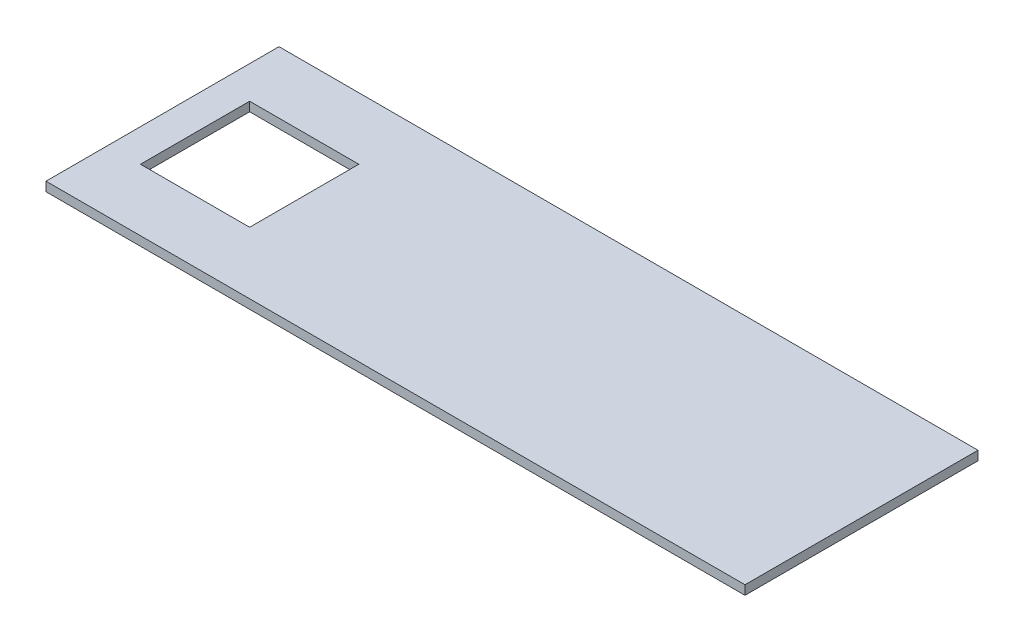
ISO-10303-21;
HEADER;
FILE_DESCRIPTION(('STEP AP214'),'2;1');
FILE_NAME('part.step','',(''),(''),'','','');
FILE_SCHEMA(('AUTOMOTIVE_DESIGN { 1 0 10303 214 1 1 1 1 }'));
ENDSEC;
DATA;
#1=APPLICATION_CONTEXT('core data for automotive mechanical design processes');
#2=APPLICATION_PROTOCOL_DEFINITION('international standard','automotive_design',2000,#1);
#3=PRODUCT_CONTEXT('',#1,'mechanical');
#4=PRODUCT('Part','Part','',(#3));
#5=PRODUCT_RELATED_PRODUCT_CATEGORY('part','',(#4));
#6=PRODUCT_DEFINITION_FORMATION('','',#4);
#7=PRODUCT_DEFINITION_CONTEXT('part definition',#1,'design');
#8=PRODUCT_DEFINITION('design','',#6,#7);
#9=PRODUCT_DEFINITION_SHAPE('','',#8);
#10=(LENGTH_UNIT() NAMED_UNIT(*) SI_UNIT(.MILLI.,.METRE.));
#11=(NAMED_UNIT(*) PLANE_ANGLE_UNIT() SI_UNIT($,.RADIAN.));
#12=(NAMED_UNIT(*) SI_UNIT($,.STERADIAN.) SOLID_ANGLE_UNIT());
#13=UNCERTAINTY_MEASURE_WITH_UNIT(LENGTH_MEASURE(1.E-05),#10,'distance_accuracy_value','');
#14=(GEOMETRIC_REPRESENTATION_CONTEXT(3) GLOBAL_UNCERTAINTY_ASSIGNED_CONTEXT((#13)) GLOBAL_UNIT_ASSIGNED_CONTEXT((#10,
#11,#12)) REPRESENTATION_CONTEXT('',''));
#15=CARTESIAN_POINT('',(0.,0.,0.));
#16=DIRECTION('',(0.,0.,1.));
#17=DIRECTION('',(1.,0.,0.));
#18=AXIS2_PLACEMENT_3D('',#15,#16,#17);
#19=CARTESIAN_POINT('',(0.,1.,0.));
#20=DIRECTION('',(1.,0.,0.));
#21=DIRECTION('',(0.,0.,-1.));
#22=AXIS2_PLACEMENT_3D('',#19,#20,#21);
#23=PLANE('',#22);
#24=DIRECTION('',(0.,0.,1.));
#25=VECTOR('',#24,1.);
#26=CARTESIAN_POINT('',(0.,0.,0.));
#27=LINE('',#26,#25);
#28=CARTESIAN_POINT('',(0.,0.,0.));
#29=VERTEX_POINT('',#28);
#30=CARTESIAN_POINT('',(0.,0.,25.4));
#31=VERTEX_POINT('',#30);
#32=EDGE_CURVE('E147',#29,#31,#27,.T.);
#33=ORIENTED_EDGE('',*,*,#32,.T.);
#34=DIRECTION('',(0.,-1.,0.));
#35=VECTOR('',#34,1.);
#36=CARTESIAN_POINT('',(0.,1.,25.4));
#37=LINE('',#36,#35);
#38=CARTESIAN_POINT('',(0.,1.,25.4));
#39=VERTEX_POINT('',#38);
#40=EDGE_CURVE('E11',#39,#31,#37,.T.);
#41=ORIENTED_EDGE('',*,*,#40,.F.);
#42=DIRECTION('',(0.,0.,1.));
#43=VECTOR('',#42,1.);
#44=CARTESIAN_POINT('',(0.,1.,0.));
#45=LINE('',#44,#43);
#46=CARTESIAN_POINT('',(0.,1.,0.));
#47=VERTEX_POINT('',#46);
#48=EDGE_CURVE('E153',#47,#39,#45,.T.);
#49=ORIENTED_EDGE('',*,*,#48,.F.);
#50=DIRECTION('',(0.,-1.,0.));
#51=VECTOR('',#50,1.);
#52=CARTESIAN_POINT('',(0.,1.,0.));
#53=LINE('',#52,#51);
#54=EDGE_CURVE('E167',#47,#29,#53,.T.);
#55=ORIENTED_EDGE('',*,*,#54,.T.);
#56=EDGE_LOOP('',(#33,#41,#49,#55));
#57=FACE_BOUND('',#56,.T.);
#58=ADVANCED_FACE('F39',(#57),#23,.F.);
#59=CARTESIAN_POINT('',(0.,1.,25.4));
#60=DIRECTION('',(0.,0.,-1.));
#61=DIRECTION('',(-1.,0.,0.));
#62=AXIS2_PLACEMENT_3D('',#59,#60,#61);
#63=PLANE('',#62);
#64=DIRECTION('',(1.,0.,0.));
#65=VECTOR('',#64,1.);
#66=CARTESIAN_POINT('',(0.,0.,25.4));
#67=LINE('',#66,#65);
#68=CARTESIAN_POINT('',(76.2,0.,25.4));
#69=VERTEX_POINT('',#68);
#70=EDGE_CURVE('E171',#31,#69,#67,.T.);
#71=ORIENTED_EDGE('',*,*,#70,.T.);
#72=DIRECTION('',(0.,-1.,0.));
#73=VECTOR('',#72,1.);
#74=CARTESIAN_POINT('',(76.2,1.,25.4));
#75=LINE('',#74,#73);
#76=CARTESIAN_POINT('',(76.2,1.,25.4));
#77=VERTEX_POINT('',#76);
#78=EDGE_CURVE('E47',#77,#69,#75,.T.);
#79=ORIENTED_EDGE('',*,*,#78,.F.);
#80=DIRECTION('',(1.,0.,0.));
#81=VECTOR('',#80,1.);
#82=CARTESIAN_POINT('',(0.,1.,25.4));
#83=LINE('',#82,#81);
#84=EDGE_CURVE('E157',#39,#77,#83,.T.);
#85=ORIENTED_EDGE('',*,*,#84,.F.);
#86=ORIENTED_EDGE('',*,*,#40,.T.);
#87=EDGE_LOOP('',(#71,#79,#85,#86));
#88=FACE_BOUND('',#87,.T.);
#89=ADVANCED_FACE('F205',(#88),#63,.F.);
#90=CARTESIAN_POINT('',(76.2,1.,25.4));
#91=DIRECTION('',(-1.,0.,0.));
#92=DIRECTION('',(0.,0.,1.));
#93=AXIS2_PLACEMENT_3D('',#90,#91,#92);
#94=PLANE('',#93);
#95=DIRECTION('',(0.,0.,-1.));
#96=VECTOR('',#95,1.);
#97=CARTESIAN_POINT('',(76.2,0.,25.4));
#98=LINE('',#97,#96);
#99=CARTESIAN_POINT('',(76.2,0.,0.));
#100=VERTEX_POINT('',#99);
#101=EDGE_CURVE('E174',#69,#100,#98,.T.);
#102=ORIENTED_EDGE('',*,*,#101,.T.);
#103=DIRECTION('',(0.,-1.,0.));
#104=VECTOR('',#103,1.);
#105=CARTESIAN_POINT('',(76.2,1.,0.));
#106=LINE('',#105,#104);
#107=CARTESIAN_POINT('',(76.2,1.,0.));
#108=VERTEX_POINT('',#107);
#109=EDGE_CURVE('E182',#108,#100,#106,.T.);
#110=ORIENTED_EDGE('',*,*,#109,.F.);
#111=DIRECTION('',(0.,0.,-1.));
#112=VECTOR('',#111,1.);
#113=CARTESIAN_POINT('',(76.2,1.,25.4));
#114=LINE('',#113,#112);
#115=EDGE_CURVE('E161',#77,#108,#114,.T.);
#116=ORIENTED_EDGE('',*,*,#115,.F.);
#117=ORIENTED_EDGE('',*,*,#78,.T.);
#118=EDGE_LOOP('',(#102,#110,#116,#117));
#119=FACE_BOUND('',#118,.T.);
#120=ADVANCED_FACE('F191',(#119),#94,.F.);
#121=CARTESIAN_POINT('',(0.,1.,0.));
#122=DIRECTION('',(0.,0.,1.));
#123=DIRECTION('',(1.,0.,0.));
#124=AXIS2_PLACEMENT_3D('',#121,#122,#123);
#125=PLANE('',#124);
#126=DIRECTION('',(-1.,0.,0.));
#127=VECTOR('',#126,1.);
#128=CARTESIAN_POINT('',(0.,0.,0.));
#129=LINE('',#128,#127);
#130=EDGE_CURVE('E158',#100,#29,#129,.T.);
#131=ORIENTED_EDGE('',*,*,#130,.T.);
#132=ORIENTED_EDGE('',*,*,#54,.F.);
#133=DIRECTION('',(-1.,0.,0.));
#134=VECTOR('',#133,1.);
#135=CARTESIAN_POINT('',(0.,1.,0.));
#136=LINE('',#135,#134);
#137=EDGE_CURVE('E164',#108,#47,#136,.T.);
#138=ORIENTED_EDGE('',*,*,#137,.F.);
#139=ORIENTED_EDGE('',*,*,#109,.T.);
#140=EDGE_LOOP('',(#131,#132,#138,#139));
#141=FACE_BOUND('',#140,.T.);
#142=ADVANCED_FACE('F198',(#141),#125,.F.);
#143=CARTESIAN_POINT('',(0.,1.,0.));
#144=DIRECTION('',(0.,1.,0.));
#145=DIRECTION('',(0.,0.,1.));
#146=AXIS2_PLACEMENT_3D('',#143,#144,#145);
#147=PLANE('',#146);
#148=DIRECTION('',(0.,0.,1.));
#149=VECTOR('',#148,1.);
#150=CARTESIAN_POINT('',(3.55,1.,12.7));
#151=LINE('',#150,#149);
#152=CARTESIAN_POINT('',(3.55,1.,6.75));
#153=VERTEX_POINT('',#152);
#154=CARTESIAN_POINT('',(3.55,1.,18.65));
#155=VERTEX_POINT('',#154);
#156=EDGE_CURVE('E108',#153,#155,#151,.T.);
#157=ORIENTED_EDGE('',*,*,#156,.F.);
#158=DIRECTION('',(-1.,0.,0.));
#159=VECTOR('',#158,1.);
#160=CARTESIAN_POINT('',(3.55,1.,6.75));
#161=LINE('',#160,#159);
#162=CARTESIAN_POINT('',(15.45,1.,6.75));
#163=VERTEX_POINT('',#162);
#164=EDGE_CURVE('E127',#163,#153,#161,.T.);
#165=ORIENTED_EDGE('',*,*,#164,.F.);
#166=DIRECTION('',(0.,0.,-1.));
#167=VECTOR('',#166,1.);
#168=CARTESIAN_POINT('',(15.45,1.,6.75));
#169=LINE('',#168,#167);
#170=CARTESIAN_POINT('',(15.45,1.,18.65));
#171=VERTEX_POINT('',#170);
#172=EDGE_CURVE('E137',#171,#163,#169,.T.);
#173=ORIENTED_EDGE('',*,*,#172,.F.);
#174=DIRECTION('',(1.,0.,0.));
#175=VECTOR('',#174,1.);
#176=CARTESIAN_POINT('',(15.45,1.,18.65));
#177=LINE('',#176,#175);
#178=EDGE_CURVE('E134',#155,#171,#177,.T.);
#179=ORIENTED_EDGE('',*,*,#178,.F.);
#180=EDGE_LOOP('',(#157,#165,#173,#179));
#181=FACE_BOUND('',#180,.T.);
#182=ORIENTED_EDGE('',*,*,#48,.T.);
#183=ORIENTED_EDGE('',*,*,#84,.T.);
#184=ORIENTED_EDGE('',*,*,#115,.T.);
#185=ORIENTED_EDGE('',*,*,#137,.T.);
#186=EDGE_LOOP('',(#182,#183,#184,#185));
#187=FACE_BOUND('',#186,.T.);
#188=ADVANCED_FACE('F204',(#181,#187),#147,.T.);
#189=CARTESIAN_POINT('',(0.,0.,0.));
#190=DIRECTION('',(0.,1.,0.));
#191=DIRECTION('',(0.,0.,1.));
#192=AXIS2_PLACEMENT_3D('',#189,#190,#191);
#193=PLANE('',#192);
#194=DIRECTION('',(-1.,0.,0.));
#195=VECTOR('',#194,1.);
#196=CARTESIAN_POINT('',(3.55,0.,6.75));
#197=LINE('',#196,#195);
#198=CARTESIAN_POINT('',(15.45,0.,6.75));
#199=VERTEX_POINT('',#198);
#200=CARTESIAN_POINT('',(3.55,0.,6.75));
#201=VERTEX_POINT('',#200);
#202=EDGE_CURVE('E112',#199,#201,#197,.T.);
#203=ORIENTED_EDGE('',*,*,#202,.T.);
#204=DIRECTION('',(0.,0.,1.));
#205=VECTOR('',#204,1.);
#206=CARTESIAN_POINT('',(3.55,0.,18.65));
#207=LINE('',#206,#205);
#208=CARTESIAN_POINT('',(3.55,0.,18.65));
#209=VERTEX_POINT('',#208);
#210=EDGE_CURVE('E105',#201,#209,#207,.T.);
#211=ORIENTED_EDGE('',*,*,#210,.T.);
#212=DIRECTION('',(1.,0.,0.));
#213=VECTOR('',#212,1.);
#214=CARTESIAN_POINT('',(15.45,0.,18.65));
#215=LINE('',#214,#213);
#216=CARTESIAN_POINT('',(15.45,0.,18.65));
#217=VERTEX_POINT('',#216);
#218=EDGE_CURVE('E115',#209,#217,#215,.T.);
#219=ORIENTED_EDGE('',*,*,#218,.T.);
#220=DIRECTION('',(0.,0.,-1.));
#221=VECTOR('',#220,1.);
#222=CARTESIAN_POINT('',(15.45,0.,6.75));
#223=LINE('',#222,#221);
#224=EDGE_CURVE('E62',#217,#199,#223,.T.);
#225=ORIENTED_EDGE('',*,*,#224,.T.);
#226=EDGE_LOOP('',(#203,#211,#219,#225));
#227=FACE_BOUND('',#226,.T.);
#228=ORIENTED_EDGE('',*,*,#32,.F.);
#229=ORIENTED_EDGE('',*,*,#130,.F.);
#230=ORIENTED_EDGE('',*,*,#101,.F.);
#231=ORIENTED_EDGE('',*,*,#70,.F.);
#232=EDGE_LOOP('',(#228,#229,#230,#231));
#233=FACE_BOUND('',#232,.T.);
#234=ADVANCED_FACE('F121',(#227,#233),#193,.F.);
#235=CARTESIAN_POINT('',(3.55,0.,12.7));
#236=DIRECTION('',(-1.,0.,0.));
#237=DIRECTION('',(0.,0.,1.));
#238=AXIS2_PLACEMENT_3D('',#235,#236,#237);
#239=PLANE('',#238);
#240=ORIENTED_EDGE('',*,*,#156,.T.);
#241=DIRECTION('',(0.,1.,0.));
#242=VECTOR('',#241,1.);
#243=CARTESIAN_POINT('',(3.55,0.,18.65));
#244=LINE('',#243,#242);
#245=EDGE_CURVE('E54',#209,#155,#244,.T.);
#246=ORIENTED_EDGE('',*,*,#245,.F.);
#247=ORIENTED_EDGE('',*,*,#210,.F.);
#248=DIRECTION('',(0.,1.,0.));
#249=VECTOR('',#248,1.);
#250=CARTESIAN_POINT('',(3.55,0.,6.75));
#251=LINE('',#250,#249);
#252=EDGE_CURVE('E144',#201,#153,#251,.T.);
#253=ORIENTED_EDGE('',*,*,#252,.T.);
#254=EDGE_LOOP('',(#240,#246,#247,#253));
#255=FACE_BOUND('',#254,.T.);
#256=ADVANCED_FACE('F103',(#255),#239,.F.);
#257=CARTESIAN_POINT('',(3.55,0.,6.75));
#258=DIRECTION('',(0.,0.,-1.));
#259=DIRECTION('',(-1.,0.,0.));
#260=AXIS2_PLACEMENT_3D('',#257,#258,#259);
#261=PLANE('',#260);
#262=ORIENTED_EDGE('',*,*,#164,.T.);
#263=ORIENTED_EDGE('',*,*,#252,.F.);
#264=ORIENTED_EDGE('',*,*,#202,.F.);
#265=DIRECTION('',(0.,1.,0.));
#266=VECTOR('',#265,1.);
#267=CARTESIAN_POINT('',(15.45,0.,6.75));
#268=LINE('',#267,#266);
#269=EDGE_CURVE('E148',#199,#163,#268,.T.);
#270=ORIENTED_EDGE('',*,*,#269,.T.);
#271=EDGE_LOOP('',(#262,#263,#264,#270));
#272=FACE_BOUND('',#271,.T.);
#273=ADVANCED_FACE('F225',(#272),#261,.F.);
#274=CARTESIAN_POINT('',(15.45,0.,6.75));
#275=DIRECTION('',(1.,0.,0.));
#276=DIRECTION('',(0.,0.,-1.));
#277=AXIS2_PLACEMENT_3D('',#274,#275,#276);
#278=PLANE('',#277);
#279=ORIENTED_EDGE('',*,*,#172,.T.);
#280=ORIENTED_EDGE('',*,*,#269,.F.);
#281=ORIENTED_EDGE('',*,*,#224,.F.);
#282=DIRECTION('',(0.,1.,0.));
#283=VECTOR('',#282,1.);
#284=CARTESIAN_POINT('',(15.45,0.,18.65));
#285=LINE('',#284,#283);
#286=EDGE_CURVE('E111',#217,#171,#285,.T.);
#287=ORIENTED_EDGE('',*,*,#286,.T.);
#288=EDGE_LOOP('',(#279,#280,#281,#287));
#289=FACE_BOUND('',#288,.T.);
#290=ADVANCED_FACE('F222',(#289),#278,.F.);
#291=CARTESIAN_POINT('',(15.45,0.,18.65));
#292=DIRECTION('',(0.,0.,1.));
#293=DIRECTION('',(1.,0.,0.));
#294=AXIS2_PLACEMENT_3D('',#291,#292,#293);
#295=PLANE('',#294);
#296=ORIENTED_EDGE('',*,*,#178,.T.);
#297=ORIENTED_EDGE('',*,*,#286,.F.);
#298=ORIENTED_EDGE('',*,*,#218,.F.);
#299=ORIENTED_EDGE('',*,*,#245,.T.);
#300=EDGE_LOOP('',(#296,#297,#298,#299));
#301=FACE_BOUND('',#300,.T.);
#302=ADVANCED_FACE('F116',(#301),#295,.F.);
#303=CLOSED_SHELL('',(#58,#89,#120,#142,#188,#234,#256,#273,#290,#302));
#304=MANIFOLD_SOLID_BREP('B2',#303);
#305=ADVANCED_BREP_SHAPE_REPRESENTATION('',(#18,#304),#14);
#306=SHAPE_DEFINITION_REPRESENTATION(#9,#305);
ENDSEC;
END-ISO-10303-21;
